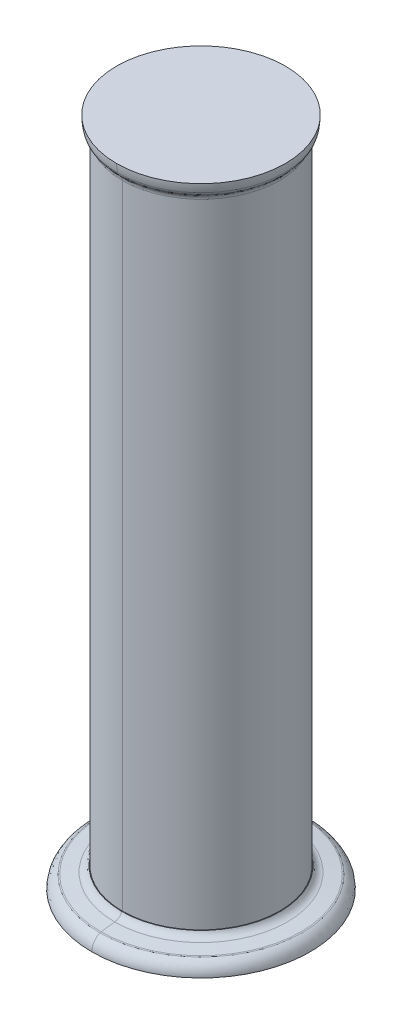
ISO-10303-21;
HEADER;
FILE_DESCRIPTION(('STEP AP214'),'2;1');
FILE_NAME('part.step','',(''),(''),'','','');
FILE_SCHEMA(('AUTOMOTIVE_DESIGN { 1 0 10303 214 1 1 1 1 }'));
ENDSEC;
DATA;
#1=APPLICATION_CONTEXT('core data for automotive mechanical design processes');
#2=APPLICATION_PROTOCOL_DEFINITION('international standard','automotive_design',2000,#1);
#3=PRODUCT_CONTEXT('',#1,'mechanical');
#4=PRODUCT('Part','Part','',(#3));
#5=PRODUCT_RELATED_PRODUCT_CATEGORY('part','',(#4));
#6=PRODUCT_DEFINITION_FORMATION('','',#4);
#7=PRODUCT_DEFINITION_CONTEXT('part definition',#1,'design');
#8=PRODUCT_DEFINITION('design','',#6,#7);
#9=PRODUCT_DEFINITION_SHAPE('','',#8);
#10=(LENGTH_UNIT() NAMED_UNIT(*) SI_UNIT(.MILLI.,.METRE.));
#11=(NAMED_UNIT(*) PLANE_ANGLE_UNIT() SI_UNIT($,.RADIAN.));
#12=(NAMED_UNIT(*) SI_UNIT($,.STERADIAN.) SOLID_ANGLE_UNIT());
#13=UNCERTAINTY_MEASURE_WITH_UNIT(LENGTH_MEASURE(1.E-05),#10,'distance_accuracy_value','');
#14=(GEOMETRIC_REPRESENTATION_CONTEXT(3) GLOBAL_UNCERTAINTY_ASSIGNED_CONTEXT((#13)) GLOBAL_UNIT_ASSIGNED_CONTEXT((#10,
#11,#12)) REPRESENTATION_CONTEXT('',''));
#15=CARTESIAN_POINT('',(0.,0.,0.));
#16=DIRECTION('',(0.,0.,1.));
#17=DIRECTION('',(1.,0.,0.));
#18=AXIS2_PLACEMENT_3D('',#15,#16,#17);
#19=CARTESIAN_POINT('',(0.,6.8,0.));
#20=DIRECTION('',(0.,1.,0.));
#21=DIRECTION('',(0.,0.,-1.));
#22=AXIS2_PLACEMENT_3D('',#19,#20,#21);
#23=CYLINDRICAL_SURFACE('',#22,54.);
#24=DIRECTION('',(0.,1.,0.));
#25=VECTOR('',#24,1.);
#26=CARTESIAN_POINT('',(0.,6.8,54.));
#27=LINE('',#26,#25);
#28=CARTESIAN_POINT('',(0.,20.5499441838477,54.));
#29=VERTEX_POINT('',#28);
#30=CARTESIAN_POINT('',(0.,455.250308653737,54.));
#31=VERTEX_POINT('',#30);
#32=EDGE_CURVE('E190',#29,#31,#27,.T.);
#33=ORIENTED_EDGE('',*,*,#32,.F.);
#34=CARTESIAN_POINT('',(0.,20.5499441838477,0.));
#35=DIRECTION('',(0.,1.,0.));
#36=DIRECTION('',(0.,0.,-1.));
#37=AXIS2_PLACEMENT_3D('',#34,#35,#36);
#38=CIRCLE('',#37,54.);
#39=CARTESIAN_POINT('',(0.,20.5499441838477,-54.));
#40=VERTEX_POINT('',#39);
#41=EDGE_CURVE('E26',#29,#40,#38,.T.);
#42=ORIENTED_EDGE('',*,*,#41,.T.);
#43=DIRECTION('',(0.,1.,0.));
#44=VECTOR('',#43,1.);
#45=CARTESIAN_POINT('',(0.,6.8,-54.));
#46=LINE('',#45,#44);
#47=CARTESIAN_POINT('',(0.,455.250308653737,-54.));
#48=VERTEX_POINT('',#47);
#49=EDGE_CURVE('E194',#40,#48,#46,.T.);
#50=ORIENTED_EDGE('',*,*,#49,.T.);
#51=CARTESIAN_POINT('',(0.,455.250308653737,0.));
#52=DIRECTION('',(0.,-1.,0.));
#53=DIRECTION('',(0.,0.,-1.));
#54=AXIS2_PLACEMENT_3D('',#51,#52,#53);
#55=CIRCLE('',#54,54.);
#56=EDGE_CURVE('E11',#48,#31,#55,.T.);
#57=ORIENTED_EDGE('',*,*,#56,.T.);
#58=EDGE_LOOP('',(#33,#42,#50,#57));
#59=FACE_BOUND('',#58,.T.);
#60=ADVANCED_FACE('F18',(#59),#23,.T.);
#61=CARTESIAN_POINT('',(0.,455.250308653737,54.));
#62=CARTESIAN_POINT('',(108.,455.250308653737,54.));
#63=CARTESIAN_POINT('',(108.,455.250308653737,-54.));
#64=CARTESIAN_POINT('',(0.,455.250308653737,-54.));
#65=CARTESIAN_POINT('',(0.,456.835594837928,54.));
#66=CARTESIAN_POINT('',(108.,456.835594837928,54.));
#67=CARTESIAN_POINT('',(108.,456.835594837928,-54.));
#68=CARTESIAN_POINT('',(0.,456.835594837928,-54.));
#69=CARTESIAN_POINT('',(0.,458.256988959683,54.7019765212804));
#70=CARTESIAN_POINT('',(109.403953042561,458.256988959683,54.7019765212805));
#71=CARTESIAN_POINT('',(109.403953042561,458.256988959683,-54.7019765212805));
#72=CARTESIAN_POINT('',(0.,458.256988959683,-54.7019765212805));
#73=CARTESIAN_POINT('',(0.,459.220594287328,55.9607843137254));
#74=CARTESIAN_POINT('',(111.921568627451,459.220594287328,55.9607843137254));
#75=CARTESIAN_POINT('',(111.921568627451,459.220594287328,-55.9607843137254));
#76=CARTESIAN_POINT('',(0.,459.220594287328,-55.9607843137255));
#77=(BOUNDED_SURFACE() B_SPLINE_SURFACE(3,3,((#61,#62,#63,#64),(#65,#66,#67,#68),(#69,#70,#71,
#72),(#73,#74,#75,#76)),.UNSPECIFIED.,.F.,.F.,.F.) B_SPLINE_SURFACE_WITH_KNOTS((4,4),(4,4),(0.,
1.),(0.,1.),.UNSPECIFIED.) GEOMETRIC_REPRESENTATION_ITEM() RATIONAL_B_SPLINE_SURFACE(((1.,
0.333333333333334,0.333333333333334,1.),(0.931077823015617,0.310359274338539,0.310359274338539,
0.931077823015617),(0.931077823015617,0.310359274338539,0.310359274338539,0.931077823015617),
(1.,0.333333333333334,0.333333333333334,1.))) REPRESENTATION_ITEM('') SURFACE());
#78=CARTESIAN_POINT('',(0.,455.250308653737,59.));
#79=DIRECTION('',(1.,0.,0.));
#80=DIRECTION('',(0.,0.,1.));
#81=AXIS2_PLACEMENT_3D('',#78,#79,#80);
#82=CIRCLE('',#81,5.);
#83=CARTESIAN_POINT('',(0.,459.220594287328,55.9607843137254));
#84=VERTEX_POINT('',#83);
#85=EDGE_CURVE('E155',#31,#84,#82,.T.);
#86=CARTESIAN_POINT('',(0.,455.250308653737,-59.));
#87=DIRECTION('',(-1.,0.,0.));
#88=DIRECTION('',(0.,0.,-1.));
#89=AXIS2_PLACEMENT_3D('',#86,#87,#88);
#90=CIRCLE('',#89,5.);
#91=CARTESIAN_POINT('',(0.,459.220594287328,-55.9607843137255));
#92=VERTEX_POINT('',#91);
#93=EDGE_CURVE('E146',#48,#92,#90,.T.);
#94=CARTESIAN_POINT('',(0.,459.220594287328,0.));
#95=DIRECTION('',(0.,1.,0.));
#96=DIRECTION('',(0.,0.,-1.));
#97=AXIS2_PLACEMENT_3D('',#94,#95,#96);
#98=CIRCLE('',#97,55.9607843137255);
#99=EDGE_CURVE('E135',#84,#92,#98,.T.);
#100=ORIENTED_EDGE('',*,*,#85,.F.);
#101=ORIENTED_EDGE('',*,*,#56,.F.);
#102=ORIENTED_EDGE('',*,*,#93,.T.);
#103=ORIENTED_EDGE('',*,*,#99,.F.);
#104=EDGE_LOOP('',(#100,#101,#102,#103));
#105=FACE_BOUND('',#104,.T.);
#106=ADVANCED_FACE('F147',(#105),#77,.F.);
#107=CARTESIAN_POINT('',(0.,20.5499441838477,-54.4));
#108=DIRECTION('',(0.,1.,0.));
#109=DIRECTION('',(0.,0.,-1.));
#110=AXIS2_PLACEMENT_3D('',#107,#108,#109);
#111=PLANE('',#110);
#112=CARTESIAN_POINT('',(0.,20.5499441838477,0.));
#113=DIRECTION('',(0.,1.,0.));
#114=DIRECTION('',(0.,0.,-1.));
#115=AXIS2_PLACEMENT_3D('',#112,#113,#114);
#116=CIRCLE('',#115,54.);
#117=EDGE_CURVE('E195',#40,#29,#116,.T.);
#118=ORIENTED_EDGE('',*,*,#117,.F.);
#119=ORIENTED_EDGE('',*,*,#41,.F.);
#120=EDGE_LOOP('',(#118,#119));
#121=FACE_BOUND('',#120,.T.);
#122=CARTESIAN_POINT('',(0.,20.5499441838477,0.));
#123=DIRECTION('',(0.,1.,0.));
#124=DIRECTION('',(0.,0.,-1.));
#125=AXIS2_PLACEMENT_3D('',#122,#123,#124);
#126=CIRCLE('',#125,54.4);
#127=CARTESIAN_POINT('',(0.,20.5499441838477,-54.4));
#128=VERTEX_POINT('',#127);
#129=CARTESIAN_POINT('',(0.,20.5499441838477,54.4));
#130=VERTEX_POINT('',#129);
#131=EDGE_CURVE('E179',#128,#130,#126,.T.);
#132=ORIENTED_EDGE('',*,*,#131,.T.);
#133=CARTESIAN_POINT('',(0.,20.5499441838477,0.));
#134=DIRECTION('',(0.,1.,0.));
#135=DIRECTION('',(0.,0.,-1.));
#136=AXIS2_PLACEMENT_3D('',#133,#134,#135);
#137=CIRCLE('',#136,54.4);
#138=EDGE_CURVE('E257',#130,#128,#137,.T.);
#139=ORIENTED_EDGE('',*,*,#138,.T.);
#140=EDGE_LOOP('',(#132,#139));
#141=FACE_BOUND('',#140,.T.);
#142=ADVANCED_FACE('F443',(#121,#141),#111,.T.);
#143=CARTESIAN_POINT('',(0.,461.470084925443,-57.2292486332782));
#144=CARTESIAN_POINT('',(-114.458497266556,461.470084925443,-57.2292486332782));
#145=CARTESIAN_POINT('',(-114.458497266556,461.470084925443,57.2292486332782));
#146=CARTESIAN_POINT('',(0.,461.470084925443,57.2292486332782));
#147=CARTESIAN_POINT('',(0.,460.617210011044,-57.0094413555982));
#148=CARTESIAN_POINT('',(-114.018882711196,460.617210011044,-57.0094413555983));
#149=CARTESIAN_POINT('',(-114.018882711196,460.617210011044,57.0094413555981));
#150=CARTESIAN_POINT('',(0.,460.617210011044,57.0094413555982));
#151=CARTESIAN_POINT('',(0.,459.85003060936,-56.5768368889498));
#152=CARTESIAN_POINT('',(-113.153673777899,459.850030609359,-56.5768368889499));
#153=CARTESIAN_POINT('',(-113.1536737779,459.850030609359,56.5768368889497));
#154=CARTESIAN_POINT('',(0.,459.85003060936,56.5768368889498));
#155=CARTESIAN_POINT('',(0.,459.220594287328,-55.9607843137254));
#156=CARTESIAN_POINT('',(-111.921568627451,459.220594287328,-55.9607843137254));
#157=CARTESIAN_POINT('',(-111.921568627451,459.220594287328,55.9607843137254));
#158=CARTESIAN_POINT('',(0.,459.220594287328,55.9607843137254));
#159=(BOUNDED_SURFACE() B_SPLINE_SURFACE(3,3,((#143,#144,#145,#146),(#147,#148,#149,#150),(#151,
#152,#153,#154),(#155,#156,#157,#158)),.UNSPECIFIED.,.F.,.F.,
.F.) B_SPLINE_SURFACE_WITH_KNOTS((4,4),(4,4),(0.,1.),(0.,1.),
.UNSPECIFIED.) GEOMETRIC_REPRESENTATION_ITEM() RATIONAL_B_SPLINE_SURFACE(((1.,0.333333333333334,
0.333333333333334,1.),(0.977385747139174,0.325795249046392,0.325795249046392,0.977385747139174),
(0.977385747139174,0.325795249046392,0.325795249046392,0.977385747139174),(1.,0.333333333333334,
0.333333333333334,1.))) REPRESENTATION_ITEM('') SURFACE());
#160=CARTESIAN_POINT('',(0.,462.717934215756,52.3874646491804));
#161=DIRECTION('',(1.,0.,0.));
#162=DIRECTION('',(0.,0.,1.));
#163=AXIS2_PLACEMENT_3D('',#160,#161,#162);
#164=CIRCLE('',#163,5.);
#165=CARTESIAN_POINT('',(0.,461.470084925443,57.2292486332782));
#166=VERTEX_POINT('',#165);
#167=EDGE_CURVE('E140',#166,#84,#164,.T.);
#168=CARTESIAN_POINT('',(0.,461.470084925443,0.));
#169=DIRECTION('',(0.,-1.,0.));
#170=DIRECTION('',(0.,0.,-1.));
#171=AXIS2_PLACEMENT_3D('',#168,#169,#170);
#172=CIRCLE('',#171,57.2292486332782);
#173=CARTESIAN_POINT('',(0.,461.470084925443,-57.2292486332782));
#174=VERTEX_POINT('',#173);
#175=EDGE_CURVE('E128',#166,#174,#172,.T.);
#176=CARTESIAN_POINT('',(0.,462.717934215756,-52.3874646491805));
#177=DIRECTION('',(-1.,0.,0.));
#178=DIRECTION('',(0.,0.,-1.));
#179=AXIS2_PLACEMENT_3D('',#176,#177,#178);
#180=CIRCLE('',#179,5.);
#181=EDGE_CURVE('E121',#174,#92,#180,.T.);
#182=CARTESIAN_POINT('',(0.,459.220594287328,0.));
#183=DIRECTION('',(0.,1.,0.));
#184=DIRECTION('',(0.,0.,-1.));
#185=AXIS2_PLACEMENT_3D('',#182,#183,#184);
#186=CIRCLE('',#185,55.9607843137255);
#187=EDGE_CURVE('E126',#92,#84,#186,.T.);
#188=ORIENTED_EDGE('',*,*,#167,.F.);
#189=ORIENTED_EDGE('',*,*,#175,.T.);
#190=ORIENTED_EDGE('',*,*,#181,.T.);
#191=ORIENTED_EDGE('',*,*,#187,.T.);
#192=EDGE_LOOP('',(#188,#189,#190,#191));
#193=FACE_BOUND('',#192,.T.);
#194=ADVANCED_FACE('F124',(#193),#159,.T.);
#195=CARTESIAN_POINT('',(0.,16.7487331968536,59.2687839395692));
#196=CARTESIAN_POINT('',(118.537567879138,16.7487331968536,59.2687839395692));
#197=CARTESIAN_POINT('',(118.537567879138,16.7487331968536,-59.2687839395691));
#198=CARTESIAN_POINT('',(0.,16.7487331968536,-59.2687839395692));
#199=CARTESIAN_POINT('',(0.,17.0260306427109,57.0103774769147));
#200=CARTESIAN_POINT('',(114.020754953829,17.0260306427109,57.0103774769148));
#201=CARTESIAN_POINT('',(114.020754953829,17.0260306427109,-57.0103774769146));
#202=CARTESIAN_POINT('',(0.,17.0260306427109,-57.0103774769147));
#203=CARTESIAN_POINT('',(0.,18.4262685962439,55.2168816454382));
#204=CARTESIAN_POINT('',(110.433763290876,18.4262685962439,55.2168816454381));
#205=CARTESIAN_POINT('',(110.433763290876,18.4262685962439,-55.2168816454381));
#206=CARTESIAN_POINT('',(0.,18.4262685962439,-55.2168816454382));
#207=CARTESIAN_POINT('',(0.,20.5499441838477,54.4));
#208=CARTESIAN_POINT('',(108.8,20.5499441838477,54.4));
#209=CARTESIAN_POINT('',(108.8,20.5499441838477,-54.4));
#210=CARTESIAN_POINT('',(0.,20.5499441838477,-54.4));
#211=(BOUNDED_SURFACE() B_SPLINE_SURFACE(3,3,((#195,#196,#197,#198),(#199,#200,#201,#202),(#203,
#204,#205,#206),(#207,#208,#209,#210)),.UNSPECIFIED.,.F.,.F.,
.F.) B_SPLINE_SURFACE_WITH_KNOTS((4,4),(4,4),(0.,1.),(0.,1.),
.UNSPECIFIED.) GEOMETRIC_REPRESENTATION_ITEM() RATIONAL_B_SPLINE_SURFACE(((1.,0.333333333333334,
0.333333333333334,1.),(0.904896432639187,0.301632144213063,0.301632144213063,0.904896432639187),
(0.904896432639187,0.301632144213063,0.301632144213063,0.904896432639187),(1.,0.333333333333334,
0.333333333333334,1.))) REPRESENTATION_ITEM('') SURFACE());
#212=CARTESIAN_POINT('',(0.,22.7040101067015,60.));
#213=DIRECTION('',(1.,0.,0.));
#214=DIRECTION('',(0.,0.,1.));
#215=AXIS2_PLACEMENT_3D('',#212,#213,#214);
#216=CIRCLE('',#215,6.);
#217=CARTESIAN_POINT('',(0.,16.7487331968536,59.2687839395692));
#218=VERTEX_POINT('',#217);
#219=EDGE_CURVE('E196',#218,#130,#216,.T.);
#220=CARTESIAN_POINT('',(0.,16.7487331968536,0.));
#221=DIRECTION('',(0.,-1.,0.));
#222=DIRECTION('',(0.,0.,-1.));
#223=AXIS2_PLACEMENT_3D('',#220,#221,#222);
#224=CIRCLE('',#223,59.2687839395691);
#225=CARTESIAN_POINT('',(0.,16.7487331968536,-59.2687839395691));
#226=VERTEX_POINT('',#225);
#227=EDGE_CURVE('E252',#226,#218,#224,.T.);
#228=CARTESIAN_POINT('',(0.,22.7040101067015,-60.));
#229=DIRECTION('',(-1.,0.,0.));
#230=DIRECTION('',(0.,0.,-1.));
#231=AXIS2_PLACEMENT_3D('',#228,#229,#230);
#232=CIRCLE('',#231,6.);
#233=EDGE_CURVE('E175',#226,#128,#232,.T.);
#234=ORIENTED_EDGE('',*,*,#219,.F.);
#235=ORIENTED_EDGE('',*,*,#227,.F.);
#236=ORIENTED_EDGE('',*,*,#233,.T.);
#237=ORIENTED_EDGE('',*,*,#138,.F.);
#238=EDGE_LOOP('',(#234,#235,#236,#237));
#239=FACE_BOUND('',#238,.T.);
#240=ADVANCED_FACE('F421',(#239),#211,.F.);
#241=CARTESIAN_POINT('',(0.,467.4,-57.9995442910996));
#242=CARTESIAN_POINT('',(-115.999088582199,467.4,-57.9995442910996));
#243=CARTESIAN_POINT('',(-115.999088582199,467.4,57.9995442910995));
#244=CARTESIAN_POINT('',(0.,467.4,57.9995442910995));
#245=CARTESIAN_POINT('',(0.,465.396692115559,-57.98728951417));
#246=CARTESIAN_POINT('',(-115.97457902834,465.396692115557,-57.9872895141699));
#247=CARTESIAN_POINT('',(-115.97457902834,465.396692115557,57.9872895141699));
#248=CARTESIAN_POINT('',(0.,465.396692115559,57.9872895141699));
#249=CARTESIAN_POINT('',(0.,463.410038027942,-57.7292232521674));
#250=CARTESIAN_POINT('',(-115.458446504335,463.410038027941,-57.7292232521674));
#251=CARTESIAN_POINT('',(-115.458446504335,463.410038027941,57.7292232521673));
#252=CARTESIAN_POINT('',(0.,463.410038027942,57.7292232521674));
#253=CARTESIAN_POINT('',(0.,461.470084925443,-57.2292486332782));
#254=CARTESIAN_POINT('',(-114.458497266556,461.470084925443,-57.2292486332782));
#255=CARTESIAN_POINT('',(-114.458497266556,461.470084925443,57.2292486332782));
#256=CARTESIAN_POINT('',(0.,461.470084925443,57.2292486332782));
#257=(BOUNDED_SURFACE() B_SPLINE_SURFACE(3,3,((#241,#242,#243,#244),(#245,#246,#247,#248),(#249,
#250,#251,#252),(#253,#254,#255,#256)),.UNSPECIFIED.,.F.,.F.,
.F.) B_SPLINE_SURFACE_WITH_KNOTS((4,4),(4,4),(0.,1.),(0.,1.),
.UNSPECIFIED.) GEOMETRIC_REPRESENTATION_ITEM() RATIONAL_B_SPLINE_SURFACE(((1.,0.333333333333334,
0.333333333333334,1.),(0.9949584935329,0.331652831177634,0.331652831177634,0.9949584935329),
(0.9949584935329,0.331652831177634,0.331652831177634,0.9949584935329),(1.,0.333333333333334,
0.333333333333334,1.))) REPRESENTATION_ITEM('') SURFACE());
#258=CARTESIAN_POINT('',(0.,467.548999036328,33.642434735736));
#259=DIRECTION('',(1.,0.,0.));
#260=DIRECTION('',(0.,0.,1.));
#261=AXIS2_PLACEMENT_3D('',#258,#259,#260);
#262=CIRCLE('',#261,24.3575652848311);
#263=CARTESIAN_POINT('',(0.,467.4,57.9995442910995));
#264=VERTEX_POINT('',#263);
#265=EDGE_CURVE('E166',#264,#166,#262,.T.);
#266=CARTESIAN_POINT('',(0.,467.4,0.));
#267=DIRECTION('',(0.,-1.,0.));
#268=DIRECTION('',(0.,0.,-1.));
#269=AXIS2_PLACEMENT_3D('',#266,#267,#268);
#270=CIRCLE('',#269,57.9995442910995);
#271=CARTESIAN_POINT('',(0.,467.4,-57.9995442910996));
#272=VERTEX_POINT('',#271);
#273=EDGE_CURVE('E249',#264,#272,#270,.T.);
#274=CARTESIAN_POINT('',(0.,467.548999036328,-33.6424347357361));
#275=DIRECTION('',(-1.,0.,0.));
#276=DIRECTION('',(0.,0.,-1.));
#277=AXIS2_PLACEMENT_3D('',#274,#275,#276);
#278=CIRCLE('',#277,24.3575652848311);
#279=EDGE_CURVE('E169',#272,#174,#278,.T.);
#280=ORIENTED_EDGE('',*,*,#265,.F.);
#281=ORIENTED_EDGE('',*,*,#273,.T.);
#282=ORIENTED_EDGE('',*,*,#279,.T.);
#283=ORIENTED_EDGE('',*,*,#175,.F.);
#284=EDGE_LOOP('',(#280,#281,#282,#283));
#285=FACE_BOUND('',#284,.T.);
#286=ADVANCED_FACE('F323',(#285),#257,.T.);
#287=CARTESIAN_POINT('',(0.,15.5970184606565,0.));
#288=DIRECTION('',(0.,-1.,0.));
#289=DIRECTION('',(0.,0.,1.));
#290=AXIS2_PLACEMENT_3D('',#287,#288,#289);
#291=CONICAL_SURFACE('',#290,68.6487477373621,1.4486232791553);
#292=DIRECTION('',(0.,-0.121869343405141,-0.992546151641323));
#293=VECTOR('',#292,1.);
#294=CARTESIAN_POINT('',(0.,15.5970184606565,-68.6487477373621));
#295=LINE('',#294,#293);
#296=CARTESIAN_POINT('',(0.,15.5970184606565,-68.6487477373621));
#297=VERTEX_POINT('',#296);
#298=EDGE_CURVE('E232',#226,#297,#295,.T.);
#299=ORIENTED_EDGE('',*,*,#298,.F.);
#300=ORIENTED_EDGE('',*,*,#227,.T.);
#301=DIRECTION('',(0.,-0.121869343405141,0.992546151641323));
#302=VECTOR('',#301,1.);
#303=CARTESIAN_POINT('',(0.,15.5970184606565,68.6487477373621));
#304=LINE('',#303,#302);
#305=CARTESIAN_POINT('',(0.,15.5970184606565,68.6487477373621));
#306=VERTEX_POINT('',#305);
#307=EDGE_CURVE('E240',#218,#306,#304,.T.);
#308=ORIENTED_EDGE('',*,*,#307,.T.);
#309=CARTESIAN_POINT('',(0.,15.5970184606565,0.));
#310=DIRECTION('',(0.,1.,0.));
#311=DIRECTION('',(0.,0.,1.));
#312=AXIS2_PLACEMENT_3D('',#309,#310,#311);
#313=CIRCLE('',#312,68.6487477373621);
#314=EDGE_CURVE('E186',#306,#297,#313,.T.);
#315=ORIENTED_EDGE('',*,*,#314,.T.);
#316=EDGE_LOOP('',(#299,#300,#308,#315));
#317=FACE_BOUND('',#316,.T.);
#318=ADVANCED_FACE('F318',(#317),#291,.T.);
#319=CARTESIAN_POINT('',(0.,467.4,-57.9995442910996));
#320=DIRECTION('',(0.,1.,0.));
#321=DIRECTION('',(0.,0.,-1.));
#322=AXIS2_PLACEMENT_3D('',#319,#320,#321);
#323=PLANE('',#322);
#324=CARTESIAN_POINT('',(0.,467.4,0.));
#325=DIRECTION('',(0.,-1.,0.));
#326=DIRECTION('',(0.,0.,-1.));
#327=AXIS2_PLACEMENT_3D('',#324,#325,#326);
#328=CIRCLE('',#327,57.9995442910995);
#329=EDGE_CURVE('E170',#272,#264,#328,.T.);
#330=ORIENTED_EDGE('',*,*,#329,.F.);
#331=ORIENTED_EDGE('',*,*,#273,.F.);
#332=EDGE_LOOP('',(#330,#331));
#333=FACE_BOUND('',#332,.T.);
#334=ADVANCED_FACE('F322',(#333),#323,.T.);
#335=CARTESIAN_POINT('',(0.,15.5970184606565,-68.6487477373621));
#336=CARTESIAN_POINT('',(-137.297495474724,15.5970184606565,-68.6487477373621));
#337=CARTESIAN_POINT('',(-137.297495474724,15.5970184606565,68.6487477373621));
#338=CARTESIAN_POINT('',(0.,15.5970184606565,68.6487477373621));
#339=CARTESIAN_POINT('',(0.,15.5620172848304,-68.9338094386763));
#340=CARTESIAN_POINT('',(-137.867618877353,15.5620172848304,-68.9338094386763));
#341=CARTESIAN_POINT('',(-137.867618877353,15.5620172848304,68.9338094386763));
#342=CARTESIAN_POINT('',(0.,15.5620172848304,68.9338094386763));
#343=CARTESIAN_POINT('',(0.,15.4844701094024,-69.2103445927679));
#344=CARTESIAN_POINT('',(-138.420689185536,15.4844701094024,-69.2103445927679));
#345=CARTESIAN_POINT('',(-138.420689185536,15.4844701094024,69.2103445927679));
#346=CARTESIAN_POINT('',(0.,15.4844701094024,69.2103445927679));
#347=CARTESIAN_POINT('',(0.,15.3661470785073,-69.4720408216769));
#348=CARTESIAN_POINT('',(-138.944081643354,15.3661470785073,-69.4720408216768));
#349=CARTESIAN_POINT('',(-138.944081643354,15.3661470785073,69.4720408216768));
#350=CARTESIAN_POINT('',(0.,15.3661470785073,69.4720408216769));
#351=(BOUNDED_SURFACE() B_SPLINE_SURFACE(3,3,((#335,#336,#337,#338),(#339,#340,#341,#342),(#343,
#344,#345,#346),(#347,#348,#349,#350)),.UNSPECIFIED.,.F.,.F.,
.F.) B_SPLINE_SURFACE_WITH_KNOTS((4,4),(4,4),(0.,1.),(0.,1.),
.UNSPECIFIED.) GEOMETRIC_REPRESENTATION_ITEM() RATIONAL_B_SPLINE_SURFACE(((1.,0.333333333333334,
0.333333333333334,1.),(0.992391108487985,0.330797036162662,0.330797036162662,0.992391108487985),
(0.992391108487985,0.330797036162662,0.330797036162662,0.992391108487985),(1.,0.333333333333334,
0.333333333333334,1.))) REPRESENTATION_ITEM('') SURFACE());
#352=CARTESIAN_POINT('',(0.,12.7803585687175,68.3029053893175));
#353=DIRECTION('',(1.,0.,0.));
#354=DIRECTION('',(0.,0.,1.));
#355=AXIS2_PLACEMENT_3D('',#352,#353,#354);
#356=CIRCLE('',#355,2.83781251610442);
#357=CARTESIAN_POINT('',(0.,15.3661470785073,69.4720408216769));
#358=VERTEX_POINT('',#357);
#359=EDGE_CURVE('E184',#306,#358,#356,.T.);
#360=CARTESIAN_POINT('',(0.,15.5970184606565,0.));
#361=DIRECTION('',(0.,1.,0.));
#362=DIRECTION('',(0.,0.,1.));
#363=AXIS2_PLACEMENT_3D('',#360,#361,#362);
#364=CIRCLE('',#363,68.6487477373621);
#365=EDGE_CURVE('E236',#297,#306,#364,.T.);
#366=CARTESIAN_POINT('',(0.,12.7803585687175,-68.3029053893175));
#367=DIRECTION('',(-1.,0.,0.));
#368=DIRECTION('',(0.,0.,-1.));
#369=AXIS2_PLACEMENT_3D('',#366,#367,#368);
#370=CIRCLE('',#369,2.83781251610442);
#371=CARTESIAN_POINT('',(0.,15.3661470785073,-69.4720408216769));
#372=VERTEX_POINT('',#371);
#373=EDGE_CURVE('E183',#297,#372,#370,.T.);
#374=CARTESIAN_POINT('',(0.,15.3661470785073,0.));
#375=DIRECTION('',(0.,1.,0.));
#376=DIRECTION('',(0.,0.,-1.));
#377=AXIS2_PLACEMENT_3D('',#374,#375,#376);
#378=CIRCLE('',#377,69.4720408216769);
#379=EDGE_CURVE('E246',#372,#358,#378,.T.);
#380=ORIENTED_EDGE('',*,*,#359,.F.);
#381=ORIENTED_EDGE('',*,*,#365,.F.);
#382=ORIENTED_EDGE('',*,*,#373,.T.);
#383=ORIENTED_EDGE('',*,*,#379,.T.);
#384=EDGE_LOOP('',(#380,#381,#382,#383));
#385=FACE_BOUND('',#384,.T.);
#386=ADVANCED_FACE('F378',(#385),#351,.T.);
#387=CARTESIAN_POINT('',(0.,15.3661470785073,-69.4720408216769));
#388=CARTESIAN_POINT('',(-138.944081643354,15.3661470785073,-69.4720408216768));
#389=CARTESIAN_POINT('',(-138.944081643354,15.3661470785073,69.4720408216768));
#390=CARTESIAN_POINT('',(0.,15.3661470785073,69.4720408216769));
#391=CARTESIAN_POINT('',(0.,13.7991933362588,-72.9376880597401));
#392=CARTESIAN_POINT('',(-145.87537611948,13.7991933362588,-72.9376880597402));
#393=CARTESIAN_POINT('',(-145.87537611948,13.7991933362588,72.9376880597402));
#394=CARTESIAN_POINT('',(0.,13.7991933362588,72.9376880597401));
#395=CARTESIAN_POINT('',(0.,10.6034267192944,-75.));
#396=CARTESIAN_POINT('',(-150.,10.6034267192944,-75.));
#397=CARTESIAN_POINT('',(-150.,10.6034267192944,75.));
#398=CARTESIAN_POINT('',(0.,10.6034267192944,75.));
#399=CARTESIAN_POINT('',(0.,6.8,-75.));
#400=CARTESIAN_POINT('',(-150.,6.79999999999999,-75.));
#401=CARTESIAN_POINT('',(-150.,6.79999999999999,75.));
#402=CARTESIAN_POINT('',(0.,6.8,75.));
#403=(BOUNDED_SURFACE() B_SPLINE_SURFACE(3,3,((#387,#388,#389,#390),(#391,#392,#393,#394),(#395,
#396,#397,#398),(#399,#400,#401,#402)),.UNSPECIFIED.,.F.,.F.,
.F.) B_SPLINE_SURFACE_WITH_KNOTS((4,4),(4,4),(0.,1.),(0.,1.),
.UNSPECIFIED.) GEOMETRIC_REPRESENTATION_ITEM() RATIONAL_B_SPLINE_SURFACE(((1.,0.333333333333334,
0.333333333333334,1.),(0.893489012728556,0.297829670909519,0.297829670909519,0.893489012728556),
(0.893489012728556,0.297829670909519,0.297829670909519,0.893489012728556),(1.,0.333333333333334,
0.333333333333334,1.))) REPRESENTATION_ITEM('') SURFACE());
#404=CARTESIAN_POINT('',(0.,6.8,65.5989529684485));
#405=DIRECTION('',(1.,0.,0.));
#406=DIRECTION('',(0.,0.,1.));
#407=AXIS2_PLACEMENT_3D('',#404,#405,#406);
#408=CIRCLE('',#407,9.40104703155156);
#409=CARTESIAN_POINT('',(0.,6.8,75.));
#410=VERTEX_POINT('',#409);
#411=EDGE_CURVE('E215',#358,#410,#408,.T.);
#412=CARTESIAN_POINT('',(0.,6.8,-65.5989529684485));
#413=DIRECTION('',(-1.,0.,0.));
#414=DIRECTION('',(0.,0.,-1.));
#415=AXIS2_PLACEMENT_3D('',#412,#413,#414);
#416=CIRCLE('',#415,9.40104703155156);
#417=CARTESIAN_POINT('',(0.,6.8,-75.));
#418=VERTEX_POINT('',#417);
#419=EDGE_CURVE('E220',#372,#418,#416,.T.);
#420=CARTESIAN_POINT('',(0.,6.8,0.));
#421=DIRECTION('',(0.,1.,0.));
#422=DIRECTION('',(0.,0.,-1.));
#423=AXIS2_PLACEMENT_3D('',#420,#421,#422);
#424=CIRCLE('',#423,75.);
#425=EDGE_CURVE('E243',#418,#410,#424,.T.);
#426=ORIENTED_EDGE('',*,*,#411,.F.);
#427=ORIENTED_EDGE('',*,*,#379,.F.);
#428=ORIENTED_EDGE('',*,*,#419,.T.);
#429=ORIENTED_EDGE('',*,*,#425,.T.);
#430=EDGE_LOOP('',(#426,#427,#428,#429));
#431=FACE_BOUND('',#430,.T.);
#432=ADVANCED_FACE('F386',(#431),#403,.T.);
#433=CARTESIAN_POINT('',(0.,6.8,-75.));
#434=DIRECTION('',(0.,-1.,0.));
#435=DIRECTION('',(-1.,0.,0.));
#436=AXIS2_PLACEMENT_3D('',#433,#434,#435);
#437=PLANE('',#436);
#438=ORIENTED_EDGE('',*,*,#425,.F.);
#439=CARTESIAN_POINT('',(0.,6.8,0.));
#440=DIRECTION('',(0.,1.,0.));
#441=DIRECTION('',(0.,0.,-1.));
#442=AXIS2_PLACEMENT_3D('',#439,#440,#441);
#443=CIRCLE('',#442,75.);
#444=EDGE_CURVE('E216',#410,#418,#443,.T.);
#445=ORIENTED_EDGE('',*,*,#444,.F.);
#446=EDGE_LOOP('',(#438,#445));
#447=FACE_BOUND('',#446,.T.);
#448=ADVANCED_FACE('F289',(#447),#437,.T.);
#449=CARTESIAN_POINT('',(0.,15.5970184606565,0.));
#450=DIRECTION('',(0.,-1.,0.));
#451=DIRECTION('',(0.,0.,1.));
#452=AXIS2_PLACEMENT_3D('',#449,#450,#451);
#453=CONICAL_SURFACE('',#452,68.6487477373621,1.4486232791553);
#454=CARTESIAN_POINT('',(0.,16.7487331968536,0.));
#455=DIRECTION('',(0.,-1.,0.));
#456=DIRECTION('',(0.,0.,-1.));
#457=AXIS2_PLACEMENT_3D('',#454,#455,#456);
#458=CIRCLE('',#457,59.2687839395691);
#459=EDGE_CURVE('E134',#218,#226,#458,.T.);
#460=ORIENTED_EDGE('',*,*,#459,.T.);
#461=ORIENTED_EDGE('',*,*,#298,.T.);
#462=ORIENTED_EDGE('',*,*,#365,.T.);
#463=ORIENTED_EDGE('',*,*,#307,.F.);
#464=EDGE_LOOP('',(#460,#461,#462,#463));
#465=FACE_BOUND('',#464,.T.);
#466=ADVANCED_FACE('F284',(#465),#453,.T.);
#467=CARTESIAN_POINT('',(0.,6.8,0.));
#468=DIRECTION('',(0.,1.,0.));
#469=DIRECTION('',(0.,0.,-1.));
#470=AXIS2_PLACEMENT_3D('',#467,#468,#469);
#471=CYLINDRICAL_SURFACE('',#470,54.);
#472=ORIENTED_EDGE('',*,*,#117,.T.);
#473=ORIENTED_EDGE('',*,*,#32,.T.);
#474=CARTESIAN_POINT('',(0.,455.250308653737,0.));
#475=DIRECTION('',(0.,-1.,0.));
#476=DIRECTION('',(0.,0.,-1.));
#477=AXIS2_PLACEMENT_3D('',#474,#475,#476);
#478=CIRCLE('',#477,54.);
#479=EDGE_CURVE('E162',#31,#48,#478,.T.);
#480=ORIENTED_EDGE('',*,*,#479,.T.);
#481=ORIENTED_EDGE('',*,*,#49,.F.);
#482=EDGE_LOOP('',(#472,#473,#480,#481));
#483=FACE_BOUND('',#482,.T.);
#484=ADVANCED_FACE('F288',(#483),#471,.T.);
#485=CARTESIAN_POINT('',(0.,15.3661470785073,69.4720408216769));
#486=CARTESIAN_POINT('',(138.944081643354,15.3661470785073,69.472040821677));
#487=CARTESIAN_POINT('',(138.944081643354,15.3661470785073,-69.4720408216768));
#488=CARTESIAN_POINT('',(0.,15.3661470785073,-69.4720408216769));
#489=CARTESIAN_POINT('',(0.,13.7991933362588,72.9376880597401));
#490=CARTESIAN_POINT('',(145.87537611948,13.7991933362588,72.9376880597402));
#491=CARTESIAN_POINT('',(145.87537611948,13.7991933362588,-72.9376880597402));
#492=CARTESIAN_POINT('',(0.,13.7991933362588,-72.9376880597401));
#493=CARTESIAN_POINT('',(0.,10.6034267192944,75.));
#494=CARTESIAN_POINT('',(150.,10.6034267192944,75.));
#495=CARTESIAN_POINT('',(150.,10.6034267192944,-75.));
#496=CARTESIAN_POINT('',(0.,10.6034267192944,-75.));
#497=CARTESIAN_POINT('',(0.,6.8,75.));
#498=CARTESIAN_POINT('',(150.,6.79999999999999,75.));
#499=CARTESIAN_POINT('',(150.,6.79999999999999,-75.));
#500=CARTESIAN_POINT('',(0.,6.8,-75.));
#501=(BOUNDED_SURFACE() B_SPLINE_SURFACE(3,3,((#485,#486,#487,#488),(#489,#490,#491,#492),(#493,
#494,#495,#496),(#497,#498,#499,#500)),.UNSPECIFIED.,.F.,.F.,
.F.) B_SPLINE_SURFACE_WITH_KNOTS((4,4),(4,4),(0.,1.),(0.,1.),
.UNSPECIFIED.) GEOMETRIC_REPRESENTATION_ITEM() RATIONAL_B_SPLINE_SURFACE(((1.,0.333333333333334,
0.333333333333334,1.),(0.893489012728556,0.297829670909519,0.297829670909519,0.893489012728556),
(0.893489012728556,0.297829670909519,0.297829670909519,0.893489012728556),(1.,0.333333333333334,
0.333333333333334,1.))) REPRESENTATION_ITEM('') SURFACE());
#502=CARTESIAN_POINT('',(0.,15.3661470785073,0.));
#503=DIRECTION('',(0.,1.,0.));
#504=DIRECTION('',(0.,0.,-1.));
#505=AXIS2_PLACEMENT_3D('',#502,#503,#504);
#506=CIRCLE('',#505,69.4720408216769);
#507=EDGE_CURVE('E180',#358,#372,#506,.T.);
#508=ORIENTED_EDGE('',*,*,#507,.F.);
#509=ORIENTED_EDGE('',*,*,#411,.T.);
#510=ORIENTED_EDGE('',*,*,#444,.T.);
#511=ORIENTED_EDGE('',*,*,#419,.F.);
#512=EDGE_LOOP('',(#508,#509,#510,#511));
#513=FACE_BOUND('',#512,.T.);
#514=ADVANCED_FACE('F331',(#513),#501,.T.);
#515=CARTESIAN_POINT('',(0.,15.5970184606565,68.6487477373621));
#516=CARTESIAN_POINT('',(137.297495474724,15.5970184606565,68.6487477373621));
#517=CARTESIAN_POINT('',(137.297495474724,15.5970184606565,-68.6487477373619));
#518=CARTESIAN_POINT('',(0.,15.5970184606565,-68.6487477373621));
#519=CARTESIAN_POINT('',(0.,15.5620172848304,68.9338094386763));
#520=CARTESIAN_POINT('',(137.867618877353,15.5620172848304,68.9338094386763));
#521=CARTESIAN_POINT('',(137.867618877353,15.5620172848304,-68.9338094386761));
#522=CARTESIAN_POINT('',(0.,15.5620172848304,-68.9338094386763));
#523=CARTESIAN_POINT('',(0.,15.4844701094024,69.2103445927679));
#524=CARTESIAN_POINT('',(138.420689185536,15.4844701094024,69.2103445927679));
#525=CARTESIAN_POINT('',(138.420689185536,15.4844701094024,-69.2103445927679));
#526=CARTESIAN_POINT('',(0.,15.4844701094024,-69.2103445927679));
#527=CARTESIAN_POINT('',(0.,15.3661470785073,69.4720408216769));
#528=CARTESIAN_POINT('',(138.944081643354,15.3661470785073,69.472040821677));
#529=CARTESIAN_POINT('',(138.944081643354,15.3661470785073,-69.4720408216768));
#530=CARTESIAN_POINT('',(0.,15.3661470785073,-69.4720408216769));
#531=(BOUNDED_SURFACE() B_SPLINE_SURFACE(3,3,((#515,#516,#517,#518),(#519,#520,#521,#522),(#523,
#524,#525,#526),(#527,#528,#529,#530)),.UNSPECIFIED.,.F.,.F.,
.F.) B_SPLINE_SURFACE_WITH_KNOTS((4,4),(4,4),(0.,1.),(0.,1.),
.UNSPECIFIED.) GEOMETRIC_REPRESENTATION_ITEM() RATIONAL_B_SPLINE_SURFACE(((1.,0.333333333333334,
0.333333333333334,1.),(0.992391108487985,0.330797036162662,0.330797036162662,0.992391108487985),
(0.992391108487985,0.330797036162662,0.330797036162662,0.992391108487985),(1.,0.333333333333334,
0.333333333333334,1.))) REPRESENTATION_ITEM('') SURFACE());
#532=ORIENTED_EDGE('',*,*,#314,.F.);
#533=ORIENTED_EDGE('',*,*,#359,.T.);
#534=ORIENTED_EDGE('',*,*,#507,.T.);
#535=ORIENTED_EDGE('',*,*,#373,.F.);
#536=EDGE_LOOP('',(#532,#533,#534,#535));
#537=FACE_BOUND('',#536,.T.);
#538=ADVANCED_FACE('F335',(#537),#531,.T.);
#539=CARTESIAN_POINT('',(0.,467.4,57.9995442910995));
#540=CARTESIAN_POINT('',(115.999088582199,467.4,57.9995442910995));
#541=CARTESIAN_POINT('',(115.999088582199,467.4,-57.9995442910995));
#542=CARTESIAN_POINT('',(0.,467.4,-57.9995442910996));
#543=CARTESIAN_POINT('',(0.,465.396692115559,57.9872895141699));
#544=CARTESIAN_POINT('',(115.97457902834,465.396692115557,57.9872895141699));
#545=CARTESIAN_POINT('',(115.97457902834,465.396692115557,-57.9872895141699));
#546=CARTESIAN_POINT('',(0.,465.396692115559,-57.98728951417));
#547=CARTESIAN_POINT('',(0.,463.410038027942,57.7292232521674));
#548=CARTESIAN_POINT('',(115.458446504335,463.410038027941,57.7292232521673));
#549=CARTESIAN_POINT('',(115.458446504335,463.410038027941,-57.7292232521673));
#550=CARTESIAN_POINT('',(0.,463.410038027942,-57.7292232521674));
#551=CARTESIAN_POINT('',(0.,461.470084925443,57.2292486332782));
#552=CARTESIAN_POINT('',(114.458497266556,461.470084925443,57.2292486332782));
#553=CARTESIAN_POINT('',(114.458497266556,461.470084925443,-57.2292486332782));
#554=CARTESIAN_POINT('',(0.,461.470084925443,-57.2292486332782));
#555=(BOUNDED_SURFACE() B_SPLINE_SURFACE(3,3,((#539,#540,#541,#542),(#543,#544,#545,#546),(#547,
#548,#549,#550),(#551,#552,#553,#554)),.UNSPECIFIED.,.F.,.F.,
.F.) B_SPLINE_SURFACE_WITH_KNOTS((4,4),(4,4),(0.,1.),(0.,1.),
.UNSPECIFIED.) GEOMETRIC_REPRESENTATION_ITEM() RATIONAL_B_SPLINE_SURFACE(((1.,0.333333333333334,
0.333333333333334,1.),(0.9949584935329,0.331652831177634,0.331652831177634,0.9949584935329),
(0.9949584935329,0.331652831177634,0.331652831177634,0.9949584935329),(1.,0.333333333333334,
0.333333333333334,1.))) REPRESENTATION_ITEM('') SURFACE());
#556=CARTESIAN_POINT('',(0.,461.470084925443,0.));
#557=DIRECTION('',(0.,-1.,0.));
#558=DIRECTION('',(0.,0.,-1.));
#559=AXIS2_PLACEMENT_3D('',#556,#557,#558);
#560=CIRCLE('',#559,57.2292486332782);
#561=EDGE_CURVE('E152',#174,#166,#560,.T.);
#562=ORIENTED_EDGE('',*,*,#329,.T.);
#563=ORIENTED_EDGE('',*,*,#265,.T.);
#564=ORIENTED_EDGE('',*,*,#561,.F.);
#565=ORIENTED_EDGE('',*,*,#279,.F.);
#566=EDGE_LOOP('',(#562,#563,#564,#565));
#567=FACE_BOUND('',#566,.T.);
#568=ADVANCED_FACE('F310',(#567),#555,.T.);
#569=CARTESIAN_POINT('',(0.,16.7487331968536,-59.2687839395692));
#570=CARTESIAN_POINT('',(-118.537567879138,16.7487331968536,-59.2687839395691));
#571=CARTESIAN_POINT('',(-118.537567879138,16.7487331968536,59.2687839395691));
#572=CARTESIAN_POINT('',(0.,16.7487331968536,59.2687839395692));
#573=CARTESIAN_POINT('',(0.,17.0260306427109,-57.0103774769147));
#574=CARTESIAN_POINT('',(-114.020754953829,17.0260306427109,-57.0103774769146));
#575=CARTESIAN_POINT('',(-114.020754953829,17.0260306427109,57.0103774769146));
#576=CARTESIAN_POINT('',(0.,17.0260306427109,57.0103774769147));
#577=CARTESIAN_POINT('',(0.,18.4262685962439,-55.2168816454382));
#578=CARTESIAN_POINT('',(-110.433763290876,18.4262685962439,-55.2168816454381));
#579=CARTESIAN_POINT('',(-110.433763290876,18.4262685962439,55.2168816454381));
#580=CARTESIAN_POINT('',(0.,18.4262685962439,55.2168816454382));
#581=CARTESIAN_POINT('',(0.,20.5499441838477,-54.4));
#582=CARTESIAN_POINT('',(-108.8,20.5499441838477,-54.4));
#583=CARTESIAN_POINT('',(-108.8,20.5499441838477,54.4));
#584=CARTESIAN_POINT('',(0.,20.5499441838477,54.4));
#585=(BOUNDED_SURFACE() B_SPLINE_SURFACE(3,3,((#569,#570,#571,#572),(#573,#574,#575,#576),(#577,
#578,#579,#580),(#581,#582,#583,#584)),.UNSPECIFIED.,.F.,.F.,
.F.) B_SPLINE_SURFACE_WITH_KNOTS((4,4),(4,4),(0.,1.),(0.,1.),
.UNSPECIFIED.) GEOMETRIC_REPRESENTATION_ITEM() RATIONAL_B_SPLINE_SURFACE(((1.,0.333333333333334,
0.333333333333334,1.),(0.904896432639187,0.301632144213063,0.301632144213063,0.904896432639187),
(0.904896432639187,0.301632144213063,0.301632144213063,0.904896432639187),(1.,0.333333333333334,
0.333333333333334,1.))) REPRESENTATION_ITEM('') SURFACE());
#586=ORIENTED_EDGE('',*,*,#459,.F.);
#587=ORIENTED_EDGE('',*,*,#219,.T.);
#588=ORIENTED_EDGE('',*,*,#131,.F.);
#589=ORIENTED_EDGE('',*,*,#233,.F.);
#590=EDGE_LOOP('',(#586,#587,#588,#589));
#591=FACE_BOUND('',#590,.T.);
#592=ADVANCED_FACE('F300',(#591),#585,.F.);
#593=CARTESIAN_POINT('',(0.,461.470084925443,57.2292486332782));
#594=CARTESIAN_POINT('',(114.458497266556,461.470084925443,57.2292486332782));
#595=CARTESIAN_POINT('',(114.458497266556,461.470084925443,-57.2292486332782));
#596=CARTESIAN_POINT('',(0.,461.470084925443,-57.2292486332782));
#597=CARTESIAN_POINT('',(0.,460.617210011044,57.0094413555982));
#598=CARTESIAN_POINT('',(114.018882711196,460.617210011044,57.0094413555981));
#599=CARTESIAN_POINT('',(114.018882711196,460.617210011044,-57.0094413555981));
#600=CARTESIAN_POINT('',(0.,460.617210011044,-57.0094413555982));
#601=CARTESIAN_POINT('',(0.,459.85003060936,56.5768368889498));
#602=CARTESIAN_POINT('',(113.153673777899,459.850030609359,56.5768368889497));
#603=CARTESIAN_POINT('',(113.1536737779,459.850030609359,-56.5768368889497));
#604=CARTESIAN_POINT('',(0.,459.85003060936,-56.5768368889498));
#605=CARTESIAN_POINT('',(0.,459.220594287328,55.9607843137254));
#606=CARTESIAN_POINT('',(111.921568627451,459.220594287328,55.9607843137254));
#607=CARTESIAN_POINT('',(111.921568627451,459.220594287328,-55.9607843137254));
#608=CARTESIAN_POINT('',(0.,459.220594287328,-55.9607843137254));
#609=(BOUNDED_SURFACE() B_SPLINE_SURFACE(3,3,((#593,#594,#595,#596),(#597,#598,#599,#600),(#601,
#602,#603,#604),(#605,#606,#607,#608)),.UNSPECIFIED.,.F.,.F.,
.F.) B_SPLINE_SURFACE_WITH_KNOTS((4,4),(4,4),(0.,1.),(0.,1.),
.UNSPECIFIED.) GEOMETRIC_REPRESENTATION_ITEM() RATIONAL_B_SPLINE_SURFACE(((1.,0.333333333333334,
0.333333333333334,1.),(0.977385747139174,0.325795249046392,0.325795249046392,0.977385747139174),
(0.977385747139174,0.325795249046392,0.325795249046392,0.977385747139174),(1.,0.333333333333334,
0.333333333333334,1.))) REPRESENTATION_ITEM('') SURFACE());
#610=ORIENTED_EDGE('',*,*,#561,.T.);
#611=ORIENTED_EDGE('',*,*,#167,.T.);
#612=ORIENTED_EDGE('',*,*,#99,.T.);
#613=ORIENTED_EDGE('',*,*,#181,.F.);
#614=EDGE_LOOP('',(#610,#611,#612,#613));
#615=FACE_BOUND('',#614,.T.);
#616=ADVANCED_FACE('F139',(#615),#609,.T.);
#617=CARTESIAN_POINT('',(0.,455.250308653737,-54.));
#618=CARTESIAN_POINT('',(-108.,455.250308653737,-54.));
#619=CARTESIAN_POINT('',(-108.,455.250308653737,54.));
#620=CARTESIAN_POINT('',(0.,455.250308653737,54.));
#621=CARTESIAN_POINT('',(0.,456.835594837928,-54.));
#622=CARTESIAN_POINT('',(-108.,456.835594837928,-54.));
#623=CARTESIAN_POINT('',(-108.,456.835594837928,54.));
#624=CARTESIAN_POINT('',(0.,456.835594837928,54.));
#625=CARTESIAN_POINT('',(0.,458.256988959683,-54.7019765212805));
#626=CARTESIAN_POINT('',(-109.403953042561,458.256988959683,-54.7019765212805));
#627=CARTESIAN_POINT('',(-109.403953042561,458.256988959683,54.7019765212805));
#628=CARTESIAN_POINT('',(0.,458.256988959683,54.7019765212804));
#629=CARTESIAN_POINT('',(0.,459.220594287328,-55.9607843137255));
#630=CARTESIAN_POINT('',(-111.921568627451,459.220594287328,-55.9607843137255));
#631=CARTESIAN_POINT('',(-111.921568627451,459.220594287328,55.9607843137254));
#632=CARTESIAN_POINT('',(0.,459.220594287328,55.9607843137254));
#633=(BOUNDED_SURFACE() B_SPLINE_SURFACE(3,3,((#617,#618,#619,#620),(#621,#622,#623,#624),(#625,
#626,#627,#628),(#629,#630,#631,#632)),.UNSPECIFIED.,.F.,.F.,
.F.) B_SPLINE_SURFACE_WITH_KNOTS((4,4),(4,4),(0.,1.),(0.,1.),
.UNSPECIFIED.) GEOMETRIC_REPRESENTATION_ITEM() RATIONAL_B_SPLINE_SURFACE(((1.,0.333333333333334,
0.333333333333334,1.),(0.931077823015617,0.310359274338539,0.310359274338539,0.931077823015617),
(0.931077823015617,0.310359274338539,0.310359274338539,0.931077823015617),(1.,0.333333333333334,
0.333333333333334,1.))) REPRESENTATION_ITEM('') SURFACE());
#634=ORIENTED_EDGE('',*,*,#479,.F.);
#635=ORIENTED_EDGE('',*,*,#85,.T.);
#636=ORIENTED_EDGE('',*,*,#187,.F.);
#637=ORIENTED_EDGE('',*,*,#93,.F.);
#638=EDGE_LOOP('',(#634,#635,#636,#637));
#639=FACE_BOUND('',#638,.T.);
#640=ADVANCED_FACE('F154',(#639),#633,.F.);
#641=CLOSED_SHELL('',(#60,#106,#142,#194,#240,#286,#318,#334,#386,#432,#448,#466,#484,#514,#538,
#568,#592,#616,#640));
#642=MANIFOLD_SOLID_BREP('B1',#641);
#643=ADVANCED_BREP_SHAPE_REPRESENTATION('',(#18,#642),#14);
#644=SHAPE_DEFINITION_REPRESENTATION(#9,#643);
ENDSEC;
END-ISO-10303-21;
